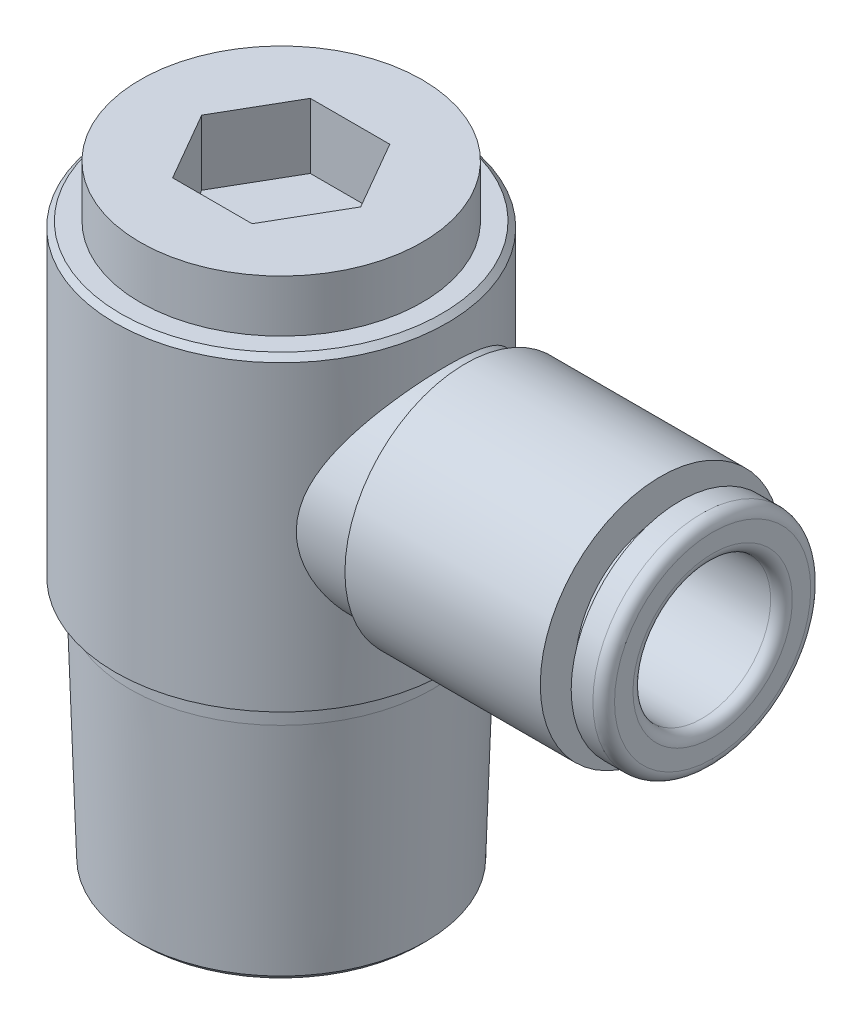
ISO-10303-21;
HEADER;
FILE_DESCRIPTION(('STEP AP214'),'2;1');
FILE_NAME('part.step','',(''),(''),'','','');
FILE_SCHEMA(('AUTOMOTIVE_DESIGN { 1 0 10303 214 1 1 1 1 }'));
ENDSEC;
DATA;
#1=APPLICATION_CONTEXT('core data for automotive mechanical design processes');
#2=APPLICATION_PROTOCOL_DEFINITION('international standard','automotive_design',2000,#1);
#3=PRODUCT_CONTEXT('',#1,'mechanical');
#4=PRODUCT('Part','Part','',(#3));
#5=PRODUCT_RELATED_PRODUCT_CATEGORY('part','',(#4));
#6=PRODUCT_DEFINITION_FORMATION('','',#4);
#7=PRODUCT_DEFINITION_CONTEXT('part definition',#1,'design');
#8=PRODUCT_DEFINITION('design','',#6,#7);
#9=PRODUCT_DEFINITION_SHAPE('','',#8);
#10=(LENGTH_UNIT() NAMED_UNIT(*) SI_UNIT(.MILLI.,.METRE.));
#11=(NAMED_UNIT(*) PLANE_ANGLE_UNIT() SI_UNIT($,.RADIAN.));
#12=(NAMED_UNIT(*) SI_UNIT($,.STERADIAN.) SOLID_ANGLE_UNIT());
#13=UNCERTAINTY_MEASURE_WITH_UNIT(LENGTH_MEASURE(1.E-05),#10,'distance_accuracy_value','');
#14=(GEOMETRIC_REPRESENTATION_CONTEXT(3) GLOBAL_UNCERTAINTY_ASSIGNED_CONTEXT((#13)) GLOBAL_UNIT_ASSIGNED_CONTEXT((#10,
#11,#12)) REPRESENTATION_CONTEXT('',''));
#15=CARTESIAN_POINT('',(0.,0.,0.));
#16=DIRECTION('',(0.,0.,1.));
#17=DIRECTION('',(1.,0.,0.));
#18=AXIS2_PLACEMENT_3D('',#15,#16,#17);
#19=CARTESIAN_POINT('',(0.,28.6374675043084,0.));
#20=DIRECTION('',(0.,-1.,0.));
#21=DIRECTION('',(0.,0.,-1.));
#22=AXIS2_PLACEMENT_3D('',#19,#20,#21);
#23=CYLINDRICAL_SURFACE('',#22,7.65);
#24=CARTESIAN_POINT('',(5.74630315942346,0.,5.05));
#25=CARTESIAN_POINT('',(5.74629139463303,0.123691195261861,5.05000721920626));
#26=CARTESIAN_POINT('',(5.75030910918097,0.247332567179655,5.04545096442382));
#27=CARTESIAN_POINT('',(5.76614951503469,0.493490762692405,5.02734312590222));
#28=CARTESIAN_POINT('',(5.77797375401058,0.616007358412272,5.01378975845184));
#29=CARTESIAN_POINT('',(5.80889561496181,0.858964449909047,4.97792972347576));
#30=CARTESIAN_POINT('',(5.8280023804657,0.979402136004425,4.95561205091152));
#31=CARTESIAN_POINT('',(5.87264713473854,1.21723144511196,4.90262313244986));
#32=CARTESIAN_POINT('',(5.898188387407,1.33462148876934,4.87194764639828));
#33=CARTESIAN_POINT('',(5.98243559048329,1.67888038499296,4.76873133896473));
#34=CARTESIAN_POINT('',(6.04913147660376,1.90042813955573,4.68460339863735));
#35=CARTESIAN_POINT('',(6.19589798944066,2.32576952661268,4.4886868162401));
#36=CARTESIAN_POINT('',(6.27597153993731,2.52955926312297,4.37689212483578));
#37=CARTESIAN_POINT('',(6.45514233643937,2.94784635976894,4.10893354808701));
#38=CARTESIAN_POINT('',(6.55528072361805,3.15925867330915,3.94860759023624));
#39=CARTESIAN_POINT('',(6.70484030309673,3.45573759233572,3.68482201507375));
#40=CARTESIAN_POINT('',(6.75462361573441,3.55118956397302,3.59293088676592));
#41=CARTESIAN_POINT('',(6.8529949039285,3.73491239665336,3.40154680759913));
#42=CARTESIAN_POINT('',(6.90158263782217,3.82318181406821,3.30205233629151));
#43=CARTESIAN_POINT('',(7.00324453769199,4.00397064010181,3.08121000385067));
#44=CARTESIAN_POINT('',(7.05598533373513,4.09533444876548,2.95875885364473));
#45=CARTESIAN_POINT('',(7.1571462005906,4.26726730033949,2.70488767442618));
#46=CARTESIAN_POINT('',(7.20556810595076,4.34784093398731,2.57347149578395));
#47=CARTESIAN_POINT('',(7.29671882217009,4.49728914746075,2.30235395890055));
#48=CARTESIAN_POINT('',(7.33945076731997,4.56617017390557,2.16265722377373));
#49=CARTESIAN_POINT('',(7.41793934480628,4.6912896786022,1.87583718443039));
#50=CARTESIAN_POINT('',(7.45369743366856,4.74753079713867,1.72871543906282));
#51=CARTESIAN_POINT('',(7.51355702226081,4.84093749631828,1.44485979435811));
#52=CARTESIAN_POINT('',(7.53850961177277,4.87952358953594,1.30877238265198));
#53=CARTESIAN_POINT('',(7.58125025191404,4.94529897041313,1.03277874196499));
#54=CARTESIAN_POINT('',(7.59903967022406,4.97249043371587,0.892873247431605));
#55=CARTESIAN_POINT('',(7.62690666268693,5.01497379379546,0.610642080943418));
#56=CARTESIAN_POINT('',(7.63699161067261,5.03027706881593,0.468318856693535));
#57=CARTESIAN_POINT('',(7.64915787014543,5.04872912968681,0.182552906952959));
#58=CARTESIAN_POINT('',(7.65124027555958,5.05187957679778,0.0391103371603215));
#59=CARTESIAN_POINT('',(7.64763364877971,5.04641457782155,-0.225955400612067));
#60=CARTESIAN_POINT('',(7.64306040008323,5.03948847025764,-0.347633129690179));
#61=CARTESIAN_POINT('',(7.62819055642115,5.01690779166283,-0.58986045632534));
#62=CARTESIAN_POINT('',(7.61789228018528,5.00125065658473,-0.710409711903723));
#63=CARTESIAN_POINT('',(7.59180448055886,4.96142345992623,-0.94944704522348));
#64=CARTESIAN_POINT('',(7.57601682246517,4.93725629002777,-1.06793580877952));
#65=CARTESIAN_POINT('',(7.53929739391156,4.8807233317845,-1.30214354928564));
#66=CARTESIAN_POINT('',(7.51836362965036,4.84835436559567,-1.41786143357439));
#67=CARTESIAN_POINT('',(7.44861329574995,4.73972224439264,-1.75905272493581));
#68=CARTESIAN_POINT('',(7.39274058965816,4.65177431497772,-1.97949958816662));
#69=CARTESIAN_POINT('',(7.26634958545281,4.44816660523506,-2.40240357219124));
#70=CARTESIAN_POINT('',(7.19582852449205,4.332501596516,-2.60485728897142));
#71=CARTESIAN_POINT('',(7.03488032391669,4.05995128632964,-3.0145413234963));
#72=CARTESIAN_POINT('',(6.94305653192188,3.89965727126989,-3.21895033027822));
#73=CARTESIAN_POINT('',(6.75345986434751,3.55115218835079,-3.59980606134531));
#74=CARTESIAN_POINT('',(6.65567798898225,3.36289823749249,-3.77620895646911));
#75=CARTESIAN_POINT('',(6.50314355973147,3.04648762707067,-4.0303089961972));
#76=CARTESIAN_POINT('',(6.44771880527447,2.92667678017511,-4.11815279322016));
#77=CARTESIAN_POINT('',(6.33916287706118,2.67906520142981,-4.28337426139859));
#78=CARTESIAN_POINT('',(6.28603220866603,2.55126272414178,-4.36074963440697));
#79=CARTESIAN_POINT('',(6.13292849259747,2.15672796630858,-4.57608477287156));
#80=CARTESIAN_POINT('',(6.0389206642722,1.87823468034047,-4.69776575809332));
#81=CARTESIAN_POINT('',(5.90576339923762,1.37782974938742,-4.86338516205354));
#82=CARTESIAN_POINT('',(5.8586197275703,1.1621115583268,-4.91957065947784));
#83=CARTESIAN_POINT('',(5.80517858746831,0.831844941344904,-4.98228001060879));
#84=CARTESIAN_POINT('',(5.790245714943,0.720673499953082,-4.99958646765062));
#85=CARTESIAN_POINT('',(5.76666561348831,0.496782643347455,-5.0267688298134));
#86=CARTESIAN_POINT('',(5.75801613472114,0.384063796943251,-5.0366473946168));
#87=CARTESIAN_POINT('',(5.74733962350418,0.157426166550954,-5.04882675712101));
#88=CARTESIAN_POINT('',(5.74534062595334,0.0435043286246889,-5.05109547607989));
#89=CARTESIAN_POINT('',(5.74812623634901,-0.184147518210976,-5.04792524343688));
#90=CARTESIAN_POINT('',(5.75291086758124,-0.297877526460553,-5.04248626537729));
#91=CARTESIAN_POINT('',(5.76906733240808,-0.524303501093791,-5.02399367343298));
#92=CARTESIAN_POINT('',(5.78044264327553,-0.636998889698366,-5.010936039885));
#93=CARTESIAN_POINT('',(5.80931661598747,-0.860505600854228,-4.97743120989856));
#94=CARTESIAN_POINT('',(5.82681775630077,-0.971316141751934,-4.95698102237329));
#95=CARTESIAN_POINT('',(5.88579390992046,-1.29027520681462,-4.88708243764574));
#96=CARTESIAN_POINT('',(5.93458101670107,-1.49508787554737,-4.82819240898766));
#97=CARTESIAN_POINT('',(6.04675011727042,-1.89198990206543,-4.68693786953897));
#98=CARTESIAN_POINT('',(6.1101369503137,-2.08407501390485,-4.60456557311215));
#99=CARTESIAN_POINT('',(6.25957633433069,-2.49096480412989,-4.39991729827344));
#100=CARTESIAN_POINT('',(6.34762880049048,-2.70267595523128,-4.27296146028159));
#101=CARTESIAN_POINT('',(6.52874451858613,-3.10430173965737,-3.99075502530789));
#102=CARTESIAN_POINT('',(6.62181376915777,-3.2941893891858,-3.8354700011959));
#103=CARTESIAN_POINT('',(6.76945312542064,-3.57965368485601,-3.56518252798513));
#104=CARTESIAN_POINT('',(6.82471127128938,-3.68285914958474,-3.45849208444374));
#105=CARTESIAN_POINT('',(6.93305481753313,-3.87995300916302,-3.2358243300389));
#106=CARTESIAN_POINT('',(6.98614088810159,-3.97384429083526,-3.11984991689777));
#107=CARTESIAN_POINT('',(7.08876046719279,-4.15160020056074,-2.87907930806883));
#108=CARTESIAN_POINT('',(7.13829574105065,-4.23546982506887,-2.75428755820565));
#109=CARTESIAN_POINT('',(7.23252522560547,-4.39242071986883,-2.49637951868224));
#110=CARTESIAN_POINT('',(7.27722075546268,-4.46550493190175,-2.36326551308694));
#111=CARTESIAN_POINT('',(7.3523965486728,-4.58688758575954,-2.11613968715941));
#112=CARTESIAN_POINT('',(7.38394975704816,-4.63724082096812,-2.00345933207119));
#113=CARTESIAN_POINT('',(7.44248371422754,-4.72988944809466,-1.77369178017961));
#114=CARTESIAN_POINT('',(7.46946531238609,-4.77218633697419,-1.65660540691652));
#115=CARTESIAN_POINT('',(7.51828162729327,-4.84823768302176,-1.41868997406963));
#116=CARTESIAN_POINT('',(7.54011836394911,-4.88199549307404,-1.29786240445549));
#117=CARTESIAN_POINT('',(7.5781595881789,-4.94054634890311,-1.05323771422447));
#118=CARTESIAN_POINT('',(7.59436670525726,-4.96534358024026,-0.929442008939753));
#119=CARTESIAN_POINT('',(7.62083690192441,-5.00573564001993,-0.679153492009262));
#120=CARTESIAN_POINT('',(7.63107324225093,-5.02128907725004,-0.552651138262618));
#121=CARTESIAN_POINT('',(7.64523454165509,-5.04278462620737,-0.298477812825458));
#122=CARTESIAN_POINT('',(7.64915949329999,-5.04872672661561,-0.170806839758873));
#123=CARTESIAN_POINT('',(7.65059793067655,-5.05090580296032,0.084651354803696));
#124=CARTESIAN_POINT('',(7.64811156036865,-5.04714299681169,0.21243857362508));
#125=CARTESIAN_POINT('',(7.63679158334367,-5.02997286600772,0.467072932700768));
#126=CARTESIAN_POINT('',(7.62795822914261,-5.01656592504618,0.593920110151967));
#127=CARTESIAN_POINT('',(7.60497100460109,-4.98154058986129,0.837142631575376));
#128=CARTESIAN_POINT('',(7.59121794425691,-4.9605397516079,0.953645412412757));
#129=CARTESIAN_POINT('',(7.55868173472171,-4.91060305350584,1.18423665510924));
#130=CARTESIAN_POINT('',(7.53989687878237,-4.88166450116244,1.29832428357183));
#131=CARTESIAN_POINT('',(7.47654311178555,-4.78343465310628,1.63586456751513));
#132=CARTESIAN_POINT('',(7.4249552279865,-4.70269976745669,1.85479417024908));
#133=CARTESIAN_POINT('',(7.30316269376434,-4.50802649664417,2.28920696971806));
#134=CARTESIAN_POINT('',(7.23199401661586,-4.39232447570483,2.50361451374155));
#135=CARTESIAN_POINT('',(7.07794345404609,-4.13377137239365,2.91078200304152));
#136=CARTESIAN_POINT('',(6.99505401956184,-3.99090277206262,3.10352785179693));
#137=CARTESIAN_POINT('',(6.80953227266373,-3.65677888017987,3.49377274135197));
#138=CARTESIAN_POINT('',(6.70584194601086,-3.46144931254873,3.68728059793821));
#139=CARTESIAN_POINT('',(6.49913391873765,-3.04173357205072,4.04050125834097));
#140=CARTESIAN_POINT('',(6.39611669857776,-2.8173286147397,4.2001920370474));
#141=CARTESIAN_POINT('',(6.21057419850602,-2.36428045178193,4.46938720627344));
#142=CARTESIAN_POINT('',(6.1270326534001,-2.13803046150941,4.5822032748568));
#143=CARTESIAN_POINT('',(5.97877850171568,-1.66600231461028,4.77404254677683));
#144=CARTESIAN_POINT('',(5.91402588265974,-1.42026709662771,4.85313773257518));
#145=CARTESIAN_POINT('',(5.82606130649867,-0.978396860963152,4.95811840716984));
#146=CARTESIAN_POINT('',(5.79647474663358,-0.785524689634158,4.9924175419868));
#147=CARTESIAN_POINT('',(5.75661031012049,-0.395057601703623,5.03834641658278));
#148=CARTESIAN_POINT('',(5.74632194118064,-0.197465310617384,5.0499884749856));
#149=CARTESIAN_POINT('',(5.74630315942346,0.,5.05));
#150=B_SPLINE_CURVE_WITH_KNOTS('',3,(#24,#25,#26,#27,#28,#29,#30,#31,#32,#33,#34,#35,#36,#37,
#38,#39,#40,#41,#42,#43,#44,#45,#46,#47,#48,#49,#50,#51,#52,#53,#54,#55,#56,#57,#58,#59,#60,#61,
#62,#63,#64,#65,#66,#67,#68,#69,#70,#71,#72,#73,#74,#75,#76,#77,#78,#79,#80,#81,#82,#83,#84,#85,
#86,#87,#88,#89,#90,#91,#92,#93,#94,#95,#96,#97,#98,#99,#100,#101,#102,#103,#104,#105,#106,#107,
#108,#109,#110,#111,#112,#113,#114,#115,#116,#117,#118,#119,#120,#121,#122,#123,#124,#125,#126,
#127,#128,#129,#130,#131,#132,#133,#134,#135,#136,#137,#138,#139,#140,#141,#142,#143,#144,#145,
#146,#147,#148,#149),.UNSPECIFIED.,.T.,.F.,(4,2,2,2,2,2,2,2,2,2,2,2,2,2,2,2,2,2,2,2,2,2,2,2,2,2,
2,2,2,2,2,2,2,2,2,2,2,2,2,2,2,2,2,2,2,2,2,2,2,2,2,2,2,2,2,2,2,2,2,2,2,2,4),(0.,
0.370840925247365,0.741755393060012,1.11313710240258,1.48470757610909,2.22001288495959,
2.95547911056464,3.80279714031537,4.22711073554562,4.65150940437718,5.13574755413301,
5.61977902317842,6.10354275267311,6.58720533716253,7.01746801647349,7.44764850574588,
7.87741675813843,8.30712626022486,8.67256438552988,9.03810988587533,9.40353129472779,
9.7690945057734,10.497388587291,11.2258201583329,12.0492638411166,12.8739837617115,
13.34915900205,13.8244383895614,14.7724003121907,15.4530126678554,15.7931269158341,
16.1331193220843,16.4745431520066,16.8159681539146,17.1575734574723,17.4993171322701,
18.1525420651435,18.8059838296506,19.5895572416453,20.3740893148105,20.8487761976557,
21.3233154941219,21.7976172055785,22.2717893103182,22.6535740424737,23.0352877652928,
23.4168513740761,23.7982365202459,24.1813167852599,24.564397501416,24.9474696159158,
25.3305264906589,25.6876430539065,26.0448809022075,26.7587556262314,27.5173645825587,
28.2764643855832,29.1545581704399,30.0332221119402,30.8290652330075,31.6232008922298,
32.2155475441831,32.8075720479368),.UNSPECIFIED.);
#151=CARTESIAN_POINT('',(5.74630315942346,0.,5.05));
#152=VERTEX_POINT('',#151);
#153=EDGE_CURVE('E128',#152,#152,#150,.T.);
#154=ORIENTED_EDGE('',*,*,#153,.T.);
#155=EDGE_LOOP('',(#154));
#156=FACE_BOUND('',#155,.T.);
#157=CARTESIAN_POINT('',(0.,6.75,0.));
#158=DIRECTION('',(0.,1.,0.));
#159=DIRECTION('',(0.,0.,1.));
#160=AXIS2_PLACEMENT_3D('',#157,#158,#159);
#161=CIRCLE('',#160,7.65);
#162=CARTESIAN_POINT('',(0.,6.75,7.65));
#163=VERTEX_POINT('',#162);
#164=EDGE_CURVE('E204',#163,#163,#161,.F.);
#165=ORIENTED_EDGE('',*,*,#164,.T.);
#166=EDGE_LOOP('',(#165));
#167=FACE_BOUND('',#166,.T.);
#168=CARTESIAN_POINT('',(0.,-7.2,0.));
#169=DIRECTION('',(0.,1.,0.));
#170=DIRECTION('',(0.,0.,1.));
#171=AXIS2_PLACEMENT_3D('',#168,#169,#170);
#172=CIRCLE('',#171,7.65);
#173=CARTESIAN_POINT('',(0.,-7.2,7.65));
#174=VERTEX_POINT('',#173);
#175=EDGE_CURVE('E278',#174,#174,#172,.F.);
#176=ORIENTED_EDGE('',*,*,#175,.F.);
#177=EDGE_LOOP('',(#176));
#178=FACE_BOUND('',#177,.T.);
#179=ADVANCED_FACE('F37',(#156,#167,#178),#23,.T.);
#180=CARTESIAN_POINT('',(0.,7.,0.));
#181=DIRECTION('',(0.,1.,0.));
#182=DIRECTION('',(0.,0.,1.));
#183=AXIS2_PLACEMENT_3D('',#180,#181,#182);
#184=PLANE('',#183);
#185=CARTESIAN_POINT('',(0.,7.,0.));
#186=DIRECTION('',(0.,1.,0.));
#187=DIRECTION('',(0.,0.,1.));
#188=AXIS2_PLACEMENT_3D('',#185,#186,#187);
#189=CIRCLE('',#188,6.5);
#190=CARTESIAN_POINT('',(0.,7.,-6.5));
#191=VERTEX_POINT('',#190);
#192=EDGE_CURVE('E141',#191,#191,#189,.T.);
#193=ORIENTED_EDGE('',*,*,#192,.F.);
#194=EDGE_LOOP('',(#193));
#195=FACE_BOUND('',#194,.T.);
#196=CARTESIAN_POINT('',(0.,7.,0.));
#197=DIRECTION('',(0.,1.,0.));
#198=DIRECTION('',(0.,0.,1.));
#199=AXIS2_PLACEMENT_3D('',#196,#197,#198);
#200=CIRCLE('',#199,7.4);
#201=CARTESIAN_POINT('',(0.,7.,7.4));
#202=VERTEX_POINT('',#201);
#203=EDGE_CURVE('E280',#202,#202,#200,.T.);
#204=ORIENTED_EDGE('',*,*,#203,.T.);
#205=EDGE_LOOP('',(#204));
#206=FACE_BOUND('',#205,.T.);
#207=ADVANCED_FACE('F265',(#195,#206),#184,.T.);
#208=CARTESIAN_POINT('',(0.,-7.2,0.));
#209=DIRECTION('',(0.,1.,0.));
#210=DIRECTION('',(0.,0.,1.));
#211=AXIS2_PLACEMENT_3D('',#208,#209,#210);
#212=PLANE('',#211);
#213=CARTESIAN_POINT('',(0.,-7.2,0.));
#214=DIRECTION('',(0.,1.,0.));
#215=DIRECTION('',(0.,0.,1.));
#216=AXIS2_PLACEMENT_3D('',#213,#214,#215);
#217=CIRCLE('',#216,7.);
#218=CARTESIAN_POINT('',(0.,-7.2,7.));
#219=VERTEX_POINT('',#218);
#220=EDGE_CURVE('E152',#219,#219,#217,.T.);
#221=ORIENTED_EDGE('',*,*,#220,.T.);
#222=EDGE_LOOP('',(#221));
#223=FACE_BOUND('',#222,.T.);
#224=ORIENTED_EDGE('',*,*,#175,.T.);
#225=EDGE_LOOP('',(#224));
#226=FACE_BOUND('',#225,.T.);
#227=ADVANCED_FACE('F187',(#223,#226),#212,.F.);
#228=CARTESIAN_POINT('',(0.,7.,0.));
#229=DIRECTION('',(0.,-1.,0.));
#230=DIRECTION('',(0.,0.,-1.));
#231=AXIS2_PLACEMENT_3D('',#228,#229,#230);
#232=CONICAL_SURFACE('',#231,7.4,0.785398163397445);
#233=ORIENTED_EDGE('',*,*,#164,.F.);
#234=EDGE_LOOP('',(#233));
#235=FACE_BOUND('',#234,.T.);
#236=ORIENTED_EDGE('',*,*,#203,.F.);
#237=EDGE_LOOP('',(#236));
#238=FACE_BOUND('',#237,.T.);
#239=ADVANCED_FACE('F185',(#235,#238),#232,.T.);
#240=CARTESIAN_POINT('',(0.,-27.9989898732233,0.));
#241=DIRECTION('',(0.,1.,0.));
#242=DIRECTION('',(0.,0.,1.));
#243=AXIS2_PLACEMENT_3D('',#240,#241,#242);
#244=CYLINDRICAL_SURFACE('',#243,7.);
#245=CARTESIAN_POINT('',(0.,-8.2,0.));
#246=DIRECTION('',(0.,-1.,0.));
#247=DIRECTION('',(0.,0.,1.));
#248=AXIS2_PLACEMENT_3D('',#245,#246,#247);
#249=CIRCLE('',#248,6.98953509812547);
#250=CARTESIAN_POINT('',(0.,-8.2,6.98953509812547));
#251=VERTEX_POINT('',#250);
#252=EDGE_CURVE('E157',#251,#251,#249,.T.);
#253=ORIENTED_EDGE('',*,*,#252,.F.);
#254=EDGE_LOOP('',(#253));
#255=FACE_BOUND('',#254,.T.);
#256=ORIENTED_EDGE('',*,*,#220,.F.);
#257=EDGE_LOOP('',(#256));
#258=FACE_BOUND('',#257,.T.);
#259=ADVANCED_FACE('F180',(#255,#258),#244,.T.);
#260=CARTESIAN_POINT('',(-6.66322807578305,-18.7,0.));
#261=DIRECTION('',(0.,-1.,0.));
#262=DIRECTION('',(0.,0.,-1.));
#263=AXIS2_PLACEMENT_3D('',#260,#261,#262);
#264=PLANE('',#263);
#265=CARTESIAN_POINT('',(0.,-18.7,0.));
#266=DIRECTION('',(0.,1.,0.));
#267=DIRECTION('',(0.,0.,-1.));
#268=AXIS2_PLACEMENT_3D('',#265,#266,#267);
#269=CIRCLE('',#268,1.5875);
#270=CARTESIAN_POINT('',(0.,-18.7,-1.5875));
#271=VERTEX_POINT('',#270);
#272=EDGE_CURVE('E520',#271,#271,#269,.T.);
#273=ORIENTED_EDGE('',*,*,#272,.T.);
#274=EDGE_LOOP('',(#273));
#275=FACE_BOUND('',#274,.T.);
#276=CARTESIAN_POINT('',(0.,-18.7,0.));
#277=DIRECTION('',(0.,-1.,0.));
#278=DIRECTION('',(0.,0.,-1.));
#279=AXIS2_PLACEMENT_3D('',#276,#277,#278);
#280=CIRCLE('',#279,6.41322807578305);
#281=CARTESIAN_POINT('',(0.,-18.7,-6.41322807578305));
#282=VERTEX_POINT('',#281);
#283=EDGE_CURVE('E203',#282,#282,#280,.T.);
#284=ORIENTED_EDGE('',*,*,#283,.T.);
#285=EDGE_LOOP('',(#284));
#286=FACE_BOUND('',#285,.T.);
#287=ADVANCED_FACE('F174',(#275,#286),#264,.T.);
#288=CARTESIAN_POINT('',(0.,-8.2,0.));
#289=DIRECTION('',(0.,1.,0.));
#290=DIRECTION('',(0.,0.,1.));
#291=AXIS2_PLACEMENT_3D('',#288,#289,#290);
#292=CONICAL_SURFACE('',#291,6.98953509812547,0.0310668606855029);
#293=CARTESIAN_POINT('',(0.,-18.4419815984457,0.));
#294=DIRECTION('',(0.,-1.,0.));
#295=DIRECTION('',(0.,0.,-1.));
#296=AXIS2_PLACEMENT_3D('',#293,#294,#295);
#297=CIRCLE('',#296,6.67124647733741);
#298=CARTESIAN_POINT('',(0.,-18.4419815984457,-6.67124647733741));
#299=VERTEX_POINT('',#298);
#300=EDGE_CURVE('E195',#299,#299,#297,.F.);
#301=ORIENTED_EDGE('',*,*,#300,.T.);
#302=EDGE_LOOP('',(#301));
#303=FACE_BOUND('',#302,.T.);
#304=ORIENTED_EDGE('',*,*,#252,.T.);
#305=EDGE_LOOP('',(#304));
#306=FACE_BOUND('',#305,.T.);
#307=ADVANCED_FACE('F163',(#303,#306),#292,.T.);
#308=CARTESIAN_POINT('',(0.,-18.4419815984456,0.));
#309=DIRECTION('',(0.,1.,0.));
#310=DIRECTION('',(0.,0.,1.));
#311=AXIS2_PLACEMENT_3D('',#308,#309,#310);
#312=CONICAL_SURFACE('',#311,6.67124647733741,0.785398163397448);
#313=ORIENTED_EDGE('',*,*,#283,.F.);
#314=EDGE_LOOP('',(#313));
#315=FACE_BOUND('',#314,.T.);
#316=ORIENTED_EDGE('',*,*,#300,.F.);
#317=EDGE_LOOP('',(#316));
#318=FACE_BOUND('',#317,.T.);
#319=ADVANCED_FACE('F173',(#315,#318),#312,.T.);
#320=CARTESIAN_POINT('',(0.,27.7847763108502,0.));
#321=DIRECTION('',(0.,-1.,0.));
#322=DIRECTION('',(0.,0.,-1.));
#323=AXIS2_PLACEMENT_3D('',#320,#321,#322);
#324=CYLINDRICAL_SURFACE('',#323,6.5);
#325=CARTESIAN_POINT('',(0.,9.4,0.));
#326=DIRECTION('',(0.,1.,0.));
#327=DIRECTION('',(0.,0.,1.));
#328=AXIS2_PLACEMENT_3D('',#325,#326,#327);
#329=CIRCLE('',#328,6.5);
#330=CARTESIAN_POINT('',(0.,9.4,-6.5));
#331=VERTEX_POINT('',#330);
#332=EDGE_CURVE('E149',#331,#331,#329,.T.);
#333=CARTESIAN_POINT('',(0.,7.,-6.5));
#334=CARTESIAN_POINT('',(0.,7.025,-6.5));
#335=CARTESIAN_POINT('',(0.,7.05,-6.5));
#336=CARTESIAN_POINT('',(0.,7.1,-6.5));
#337=CARTESIAN_POINT('',(0.,7.125,-6.5));
#338=CARTESIAN_POINT('',(0.,7.175,-6.5));
#339=CARTESIAN_POINT('',(0.,7.2,-6.5));
#340=CARTESIAN_POINT('',(0.,7.25,-6.5));
#341=CARTESIAN_POINT('',(0.,7.275,-6.5));
#342=CARTESIAN_POINT('',(0.,7.325,-6.5));
#343=CARTESIAN_POINT('',(0.,7.35,-6.5));
#344=CARTESIAN_POINT('',(0.,7.4,-6.5));
#345=CARTESIAN_POINT('',(0.,7.425,-6.5));
#346=CARTESIAN_POINT('',(0.,7.475,-6.5));
#347=CARTESIAN_POINT('',(0.,7.5,-6.5));
#348=CARTESIAN_POINT('',(0.,7.55,-6.5));
#349=CARTESIAN_POINT('',(0.,7.575,-6.5));
#350=CARTESIAN_POINT('',(0.,7.625,-6.5));
#351=CARTESIAN_POINT('',(0.,7.65,-6.5));
#352=CARTESIAN_POINT('',(0.,7.7,-6.5));
#353=CARTESIAN_POINT('',(0.,7.725,-6.5));
#354=CARTESIAN_POINT('',(0.,7.775,-6.5));
#355=CARTESIAN_POINT('',(0.,7.8,-6.5));
#356=CARTESIAN_POINT('',(0.,7.85,-6.5));
#357=CARTESIAN_POINT('',(0.,7.875,-6.5));
#358=CARTESIAN_POINT('',(0.,7.925,-6.5));
#359=CARTESIAN_POINT('',(0.,7.95,-6.5));
#360=CARTESIAN_POINT('',(0.,8.,-6.5));
#361=CARTESIAN_POINT('',(0.,8.025,-6.5));
#362=CARTESIAN_POINT('',(0.,8.075,-6.5));
#363=CARTESIAN_POINT('',(0.,8.1,-6.5));
#364=CARTESIAN_POINT('',(0.,8.15,-6.5));
#365=CARTESIAN_POINT('',(0.,8.175,-6.5));
#366=CARTESIAN_POINT('',(0.,8.225,-6.5));
#367=CARTESIAN_POINT('',(0.,8.25,-6.5));
#368=CARTESIAN_POINT('',(0.,8.3,-6.5));
#369=CARTESIAN_POINT('',(0.,8.325,-6.5));
#370=CARTESIAN_POINT('',(0.,8.375,-6.5));
#371=CARTESIAN_POINT('',(0.,8.4,-6.5));
#372=CARTESIAN_POINT('',(0.,8.45,-6.5));
#373=CARTESIAN_POINT('',(0.,8.475,-6.5));
#374=CARTESIAN_POINT('',(0.,8.525,-6.5));
#375=CARTESIAN_POINT('',(0.,8.55,-6.5));
#376=CARTESIAN_POINT('',(0.,8.6,-6.5));
#377=CARTESIAN_POINT('',(0.,8.625,-6.5));
#378=CARTESIAN_POINT('',(0.,8.675,-6.5));
#379=CARTESIAN_POINT('',(0.,8.7,-6.5));
#380=CARTESIAN_POINT('',(0.,8.75,-6.5));
#381=CARTESIAN_POINT('',(0.,8.775,-6.5));
#382=CARTESIAN_POINT('',(0.,8.825,-6.5));
#383=CARTESIAN_POINT('',(0.,8.85,-6.5));
#384=CARTESIAN_POINT('',(0.,8.9,-6.5));
#385=CARTESIAN_POINT('',(0.,8.925,-6.5));
#386=CARTESIAN_POINT('',(0.,8.975,-6.5));
#387=CARTESIAN_POINT('',(0.,9.,-6.5));
#388=CARTESIAN_POINT('',(0.,9.05,-6.5));
#389=CARTESIAN_POINT('',(0.,9.075,-6.5));
#390=CARTESIAN_POINT('',(0.,9.125,-6.5));
#391=CARTESIAN_POINT('',(0.,9.15,-6.5));
#392=CARTESIAN_POINT('',(0.,9.2,-6.5));
#393=CARTESIAN_POINT('',(0.,9.225,-6.5));
#394=CARTESIAN_POINT('',(0.,9.275,-6.5));
#395=CARTESIAN_POINT('',(0.,9.3,-6.5));
#396=CARTESIAN_POINT('',(0.,9.35,-6.5));
#397=CARTESIAN_POINT('',(0.,9.375,-6.5));
#398=CARTESIAN_POINT('',(0.,9.4,-6.5));
#399=B_SPLINE_CURVE_WITH_KNOTS('',3,(#333,#334,#335,#336,#337,#338,#339,#340,#341,#342,#343,
#344,#345,#346,#347,#348,#349,#350,#351,#352,#353,#354,#355,#356,#357,#358,#359,#360,#361,#362,
#363,#364,#365,#366,#367,#368,#369,#370,#371,#372,#373,#374,#375,#376,#377,#378,#379,#380,#381,
#382,#383,#384,#385,#386,#387,#388,#389,#390,#391,#392,#393,#394,#395,#396,#397,#398),
.UNSPECIFIED.,.F.,.F.,(4,2,2,2,2,2,2,2,2,2,2,2,2,2,2,2,2,2,2,2,2,2,2,2,2,2,2,2,2,2,2,2,4),(0.,
0.0749999999999987,0.150000000000001,0.225,0.300000000000002,0.375,0.449999999999999,
0.525000000000001,0.6,0.674999999999998,0.750000000000001,0.824999999999999,0.899999999999998,
0.975,1.05,1.125,1.2,1.275,1.35,1.425,1.5,1.575,1.65,1.725,1.8,1.875,1.95,2.025,2.1,2.175,2.25,
2.325,2.4),.UNSPECIFIED.);
#400=EDGE_CURVE('BSEAM254',#191,#331,#399,.T.);
#401=ORIENTED_EDGE('',*,*,#192,.T.);
#402=ORIENTED_EDGE('',*,*,#332,.F.);
#403=ORIENTED_EDGE('',*,*,#400,.T.);
#404=ORIENTED_EDGE('',*,*,#400,.F.);
#405=EDGE_LOOP('',(#401,#403,#402,#404));
#406=FACE_BOUND('',#405,.T.);
#407=ADVANCED_FACE('F254',(#406),#324,.T.);
#408=CARTESIAN_POINT('',(0.,9.4,0.));
#409=DIRECTION('',(0.,1.,0.));
#410=DIRECTION('',(0.,0.,1.));
#411=AXIS2_PLACEMENT_3D('',#408,#409,#410);
#412=PLANE('',#411);
#413=DIRECTION('',(1.,0.,0.));
#414=VECTOR('',#413,1.);
#415=CARTESIAN_POINT('',(-1.83308710467706,9.4,3.175));
#416=LINE('',#415,#414);
#417=CARTESIAN_POINT('',(-1.83308710467706,9.4,3.175));
#418=VERTEX_POINT('',#417);
#419=CARTESIAN_POINT('',(1.83308710467706,9.4,3.175));
#420=VERTEX_POINT('',#419);
#421=EDGE_CURVE('E53',#418,#420,#416,.T.);
#422=ORIENTED_EDGE('',*,*,#421,.F.);
#423=DIRECTION('',(0.5,0.,0.866025403784439));
#424=VECTOR('',#423,1.);
#425=CARTESIAN_POINT('',(-3.66617420935412,9.4,0.));
#426=LINE('',#425,#424);
#427=CARTESIAN_POINT('',(-3.66617420935412,9.4,0.));
#428=VERTEX_POINT('',#427);
#429=EDGE_CURVE('E137',#428,#418,#426,.T.);
#430=ORIENTED_EDGE('',*,*,#429,.F.);
#431=DIRECTION('',(-0.5,0.,0.866025403784438));
#432=VECTOR('',#431,1.);
#433=CARTESIAN_POINT('',(-1.83308710467706,9.4,-3.175));
#434=LINE('',#433,#432);
#435=CARTESIAN_POINT('',(-1.83308710467706,9.4,-3.175));
#436=VERTEX_POINT('',#435);
#437=EDGE_CURVE('E135',#436,#428,#434,.T.);
#438=ORIENTED_EDGE('',*,*,#437,.F.);
#439=DIRECTION('',(-1.,0.,0.));
#440=VECTOR('',#439,1.);
#441=CARTESIAN_POINT('',(1.83308710467706,9.4,-3.175));
#442=LINE('',#441,#440);
#443=CARTESIAN_POINT('',(1.83308710467706,9.4,-3.175));
#444=VERTEX_POINT('',#443);
#445=EDGE_CURVE('E101',#444,#436,#442,.T.);
#446=ORIENTED_EDGE('',*,*,#445,.F.);
#447=DIRECTION('',(-0.5,0.,-0.866025403784439));
#448=VECTOR('',#447,1.);
#449=CARTESIAN_POINT('',(3.66617420935412,9.4,0.));
#450=LINE('',#449,#448);
#451=CARTESIAN_POINT('',(3.66617420935412,9.4,0.));
#452=VERTEX_POINT('',#451);
#453=EDGE_CURVE('E131',#452,#444,#450,.T.);
#454=ORIENTED_EDGE('',*,*,#453,.F.);
#455=DIRECTION('',(0.5,0.,-0.866025403784439));
#456=VECTOR('',#455,1.);
#457=CARTESIAN_POINT('',(1.83308710467706,9.4,3.175));
#458=LINE('',#457,#456);
#459=EDGE_CURVE('E127',#420,#452,#458,.T.);
#460=ORIENTED_EDGE('',*,*,#459,.F.);
#461=EDGE_LOOP('',(#422,#430,#438,#446,#454,#460));
#462=FACE_BOUND('',#461,.T.);
#463=ORIENTED_EDGE('',*,*,#332,.T.);
#464=EDGE_LOOP('',(#463));
#465=FACE_BOUND('',#464,.T.);
#466=ADVANCED_FACE('F176',(#462,#465),#412,.T.);
#467=CARTESIAN_POINT('',(-1.83308710467706,6.4,3.175));
#468=DIRECTION('',(0.,0.,1.));
#469=DIRECTION('',(1.,0.,0.));
#470=AXIS2_PLACEMENT_3D('',#467,#468,#469);
#471=PLANE('',#470);
#472=ORIENTED_EDGE('',*,*,#421,.T.);
#473=DIRECTION('',(0.,1.,0.));
#474=VECTOR('',#473,1.);
#475=CARTESIAN_POINT('',(1.83308710467706,6.4,3.175));
#476=LINE('',#475,#474);
#477=CARTESIAN_POINT('',(1.83308710467706,6.4,3.175));
#478=VERTEX_POINT('',#477);
#479=EDGE_CURVE('E83',#478,#420,#476,.T.);
#480=ORIENTED_EDGE('',*,*,#479,.F.);
#481=DIRECTION('',(1.,0.,0.));
#482=VECTOR('',#481,1.);
#483=CARTESIAN_POINT('',(-1.83308710467706,6.4,3.175));
#484=LINE('',#483,#482);
#485=CARTESIAN_POINT('',(-1.83308710467706,6.4,3.175));
#486=VERTEX_POINT('',#485);
#487=EDGE_CURVE('E139',#486,#478,#484,.T.);
#488=ORIENTED_EDGE('',*,*,#487,.F.);
#489=DIRECTION('',(0.,1.,0.));
#490=VECTOR('',#489,1.);
#491=CARTESIAN_POINT('',(-1.83308710467706,6.4,3.175));
#492=LINE('',#491,#490);
#493=EDGE_CURVE('E61',#486,#418,#492,.T.);
#494=ORIENTED_EDGE('',*,*,#493,.T.);
#495=EDGE_LOOP('',(#472,#480,#488,#494));
#496=FACE_BOUND('',#495,.T.);
#497=ADVANCED_FACE('F241',(#496),#471,.F.);
#498=CARTESIAN_POINT('',(-3.66617420935412,6.4,0.));
#499=DIRECTION('',(-0.866025403784439,0.,0.5));
#500=DIRECTION('',(0.5,0.,0.866025403784439));
#501=AXIS2_PLACEMENT_3D('',#498,#499,#500);
#502=PLANE('',#501);
#503=ORIENTED_EDGE('',*,*,#429,.T.);
#504=ORIENTED_EDGE('',*,*,#493,.F.);
#505=DIRECTION('',(0.5,0.,0.866025403784439));
#506=VECTOR('',#505,1.);
#507=CARTESIAN_POINT('',(-3.66617420935412,6.4,0.));
#508=LINE('',#507,#506);
#509=CARTESIAN_POINT('',(-3.66617420935412,6.4,0.));
#510=VERTEX_POINT('',#509);
#511=EDGE_CURVE('E113',#510,#486,#508,.T.);
#512=ORIENTED_EDGE('',*,*,#511,.F.);
#513=DIRECTION('',(0.,1.,0.));
#514=VECTOR('',#513,1.);
#515=CARTESIAN_POINT('',(-3.66617420935412,6.4,0.));
#516=LINE('',#515,#514);
#517=EDGE_CURVE('E105',#510,#428,#516,.T.);
#518=ORIENTED_EDGE('',*,*,#517,.T.);
#519=EDGE_LOOP('',(#503,#504,#512,#518));
#520=FACE_BOUND('',#519,.T.);
#521=ADVANCED_FACE('F238',(#520),#502,.F.);
#522=CARTESIAN_POINT('',(-1.83308710467706,6.4,-3.175));
#523=DIRECTION('',(-0.866025403784439,0.,-0.5));
#524=DIRECTION('',(-0.5,0.,0.866025403784439));
#525=AXIS2_PLACEMENT_3D('',#522,#523,#524);
#526=PLANE('',#525);
#527=ORIENTED_EDGE('',*,*,#437,.T.);
#528=ORIENTED_EDGE('',*,*,#517,.F.);
#529=DIRECTION('',(-0.5,0.,0.866025403784438));
#530=VECTOR('',#529,1.);
#531=CARTESIAN_POINT('',(-1.83308710467706,6.4,-3.175));
#532=LINE('',#531,#530);
#533=CARTESIAN_POINT('',(-1.83308710467706,6.4,-3.175));
#534=VERTEX_POINT('',#533);
#535=EDGE_CURVE('E109',#534,#510,#532,.T.);
#536=ORIENTED_EDGE('',*,*,#535,.F.);
#537=DIRECTION('',(0.,1.,0.));
#538=VECTOR('',#537,1.);
#539=CARTESIAN_POINT('',(-1.83308710467706,6.4,-3.175));
#540=LINE('',#539,#538);
#541=EDGE_CURVE('E94',#534,#436,#540,.T.);
#542=ORIENTED_EDGE('',*,*,#541,.T.);
#543=EDGE_LOOP('',(#527,#528,#536,#542));
#544=FACE_BOUND('',#543,.T.);
#545=ADVANCED_FACE('F110',(#544),#526,.F.);
#546=CARTESIAN_POINT('',(1.83308710467706,6.4,-3.175));
#547=DIRECTION('',(0.,0.,-1.));
#548=DIRECTION('',(-1.,0.,0.));
#549=AXIS2_PLACEMENT_3D('',#546,#547,#548);
#550=PLANE('',#549);
#551=ORIENTED_EDGE('',*,*,#445,.T.);
#552=ORIENTED_EDGE('',*,*,#541,.F.);
#553=DIRECTION('',(-1.,0.,0.));
#554=VECTOR('',#553,1.);
#555=CARTESIAN_POINT('',(1.83308710467706,6.4,-3.175));
#556=LINE('',#555,#554);
#557=CARTESIAN_POINT('',(1.83308710467706,6.4,-3.175));
#558=VERTEX_POINT('',#557);
#559=EDGE_CURVE('E98',#558,#534,#556,.T.);
#560=ORIENTED_EDGE('',*,*,#559,.F.);
#561=DIRECTION('',(0.,1.,0.));
#562=VECTOR('',#561,1.);
#563=CARTESIAN_POINT('',(1.83308710467706,6.4,-3.175));
#564=LINE('',#563,#562);
#565=EDGE_CURVE('E106',#558,#444,#564,.T.);
#566=ORIENTED_EDGE('',*,*,#565,.T.);
#567=EDGE_LOOP('',(#551,#552,#560,#566));
#568=FACE_BOUND('',#567,.T.);
#569=ADVANCED_FACE('F96',(#568),#550,.F.);
#570=CARTESIAN_POINT('',(3.66617420935412,6.4,0.));
#571=DIRECTION('',(0.866025403784439,0.,-0.5));
#572=DIRECTION('',(-0.5,0.,-0.866025403784439));
#573=AXIS2_PLACEMENT_3D('',#570,#571,#572);
#574=PLANE('',#573);
#575=ORIENTED_EDGE('',*,*,#453,.T.);
#576=ORIENTED_EDGE('',*,*,#565,.F.);
#577=DIRECTION('',(-0.5,0.,-0.866025403784439));
#578=VECTOR('',#577,1.);
#579=CARTESIAN_POINT('',(3.66617420935412,6.4,0.));
#580=LINE('',#579,#578);
#581=CARTESIAN_POINT('',(3.66617420935412,6.4,0.));
#582=VERTEX_POINT('',#581);
#583=EDGE_CURVE('E119',#582,#558,#580,.T.);
#584=ORIENTED_EDGE('',*,*,#583,.F.);
#585=DIRECTION('',(0.,1.,0.));
#586=VECTOR('',#585,1.);
#587=CARTESIAN_POINT('',(3.66617420935412,6.4,0.));
#588=LINE('',#587,#586);
#589=EDGE_CURVE('E144',#582,#452,#588,.T.);
#590=ORIENTED_EDGE('',*,*,#589,.T.);
#591=EDGE_LOOP('',(#575,#576,#584,#590));
#592=FACE_BOUND('',#591,.T.);
#593=ADVANCED_FACE('F246',(#592),#574,.F.);
#594=CARTESIAN_POINT('',(1.83308710467706,6.4,3.175));
#595=DIRECTION('',(0.866025403784439,0.,0.5));
#596=DIRECTION('',(0.5,0.,-0.866025403784439));
#597=AXIS2_PLACEMENT_3D('',#594,#595,#596);
#598=PLANE('',#597);
#599=ORIENTED_EDGE('',*,*,#459,.T.);
#600=ORIENTED_EDGE('',*,*,#589,.F.);
#601=DIRECTION('',(0.5,0.,-0.866025403784439));
#602=VECTOR('',#601,1.);
#603=CARTESIAN_POINT('',(1.83308710467706,6.4,3.175));
#604=LINE('',#603,#602);
#605=EDGE_CURVE('E121',#478,#582,#604,.T.);
#606=ORIENTED_EDGE('',*,*,#605,.F.);
#607=ORIENTED_EDGE('',*,*,#479,.T.);
#608=EDGE_LOOP('',(#599,#600,#606,#607));
#609=FACE_BOUND('',#608,.T.);
#610=ADVANCED_FACE('F237',(#609),#598,.F.);
#611=CARTESIAN_POINT('',(5.49926131403118,6.4,3.175));
#612=DIRECTION('',(0.,1.,0.));
#613=DIRECTION('',(0.,0.,1.));
#614=AXIS2_PLACEMENT_3D('',#611,#612,#613);
#615=PLANE('',#614);
#616=ORIENTED_EDGE('',*,*,#487,.T.);
#617=ORIENTED_EDGE('',*,*,#605,.T.);
#618=ORIENTED_EDGE('',*,*,#583,.T.);
#619=ORIENTED_EDGE('',*,*,#559,.T.);
#620=ORIENTED_EDGE('',*,*,#535,.T.);
#621=ORIENTED_EDGE('',*,*,#511,.T.);
#622=EDGE_LOOP('',(#616,#617,#618,#619,#620,#621));
#623=FACE_BOUND('',#622,.T.);
#624=ADVANCED_FACE('F116',(#623),#615,.T.);
#625=CARTESIAN_POINT('',(-16.3355334196476,0.,0.));
#626=DIRECTION('',(-1.,0.,0.));
#627=DIRECTION('',(0.,0.,1.));
#628=AXIS2_PLACEMENT_3D('',#625,#626,#627);
#629=CYLINDRICAL_SURFACE('',#628,5.05);
#630=CARTESIAN_POINT('',(8.2,0.,0.));
#631=DIRECTION('',(-1.,0.,0.));
#632=DIRECTION('',(0.,0.,1.));
#633=AXIS2_PLACEMENT_3D('',#630,#631,#632);
#634=CIRCLE('',#633,5.05);
#635=CARTESIAN_POINT('',(8.2,0.,5.05));
#636=VERTEX_POINT('',#635);
#637=EDGE_CURVE('E535',#636,#636,#634,.T.);
#638=ORIENTED_EDGE('',*,*,#637,.T.);
#639=EDGE_LOOP('',(#638));
#640=FACE_BOUND('',#639,.T.);
#641=ORIENTED_EDGE('',*,*,#153,.F.);
#642=EDGE_LOOP('',(#641));
#643=FACE_BOUND('',#642,.T.);
#644=ADVANCED_FACE('F215',(#640,#643),#629,.T.);
#645=CARTESIAN_POINT('',(17.5,0.,5.55));
#646=DIRECTION('',(1.,0.,0.));
#647=DIRECTION('',(0.,0.,-1.));
#648=AXIS2_PLACEMENT_3D('',#645,#646,#647);
#649=PLANE('',#648);
#650=CARTESIAN_POINT('',(17.5,0.,0.));
#651=DIRECTION('',(-1.,0.,0.));
#652=DIRECTION('',(0.,0.,1.));
#653=AXIS2_PLACEMENT_3D('',#650,#651,#652);
#654=CIRCLE('',#653,3.925);
#655=CARTESIAN_POINT('',(17.5,0.,3.925));
#656=VERTEX_POINT('',#655);
#657=EDGE_CURVE('E515',#656,#656,#654,.T.);
#658=ORIENTED_EDGE('',*,*,#657,.T.);
#659=EDGE_LOOP('',(#658));
#660=FACE_BOUND('',#659,.T.);
#661=CARTESIAN_POINT('',(17.5,0.,0.));
#662=DIRECTION('',(-1.,0.,0.));
#663=DIRECTION('',(0.,0.,1.));
#664=AXIS2_PLACEMENT_3D('',#661,#662,#663);
#665=CIRCLE('',#664,5.55);
#666=CARTESIAN_POINT('',(17.5,0.,5.55));
#667=VERTEX_POINT('',#666);
#668=EDGE_CURVE('E212',#667,#667,#665,.T.);
#669=ORIENTED_EDGE('',*,*,#668,.F.);
#670=EDGE_LOOP('',(#669));
#671=FACE_BOUND('',#670,.T.);
#672=ADVANCED_FACE('F220',(#660,#671),#649,.T.);
#673=CARTESIAN_POINT('',(-16.3355334196476,0.,0.));
#674=DIRECTION('',(-1.,0.,0.));
#675=DIRECTION('',(0.,0.,1.));
#676=AXIS2_PLACEMENT_3D('',#673,#674,#675);
#677=CYLINDRICAL_SURFACE('',#676,5.55);
#678=ORIENTED_EDGE('',*,*,#668,.T.);
#679=EDGE_LOOP('',(#678));
#680=FACE_BOUND('',#679,.T.);
#681=CARTESIAN_POINT('',(8.48867513459481,0.,0.));
#682=DIRECTION('',(-1.,0.,0.));
#683=DIRECTION('',(0.,0.,1.));
#684=AXIS2_PLACEMENT_3D('',#681,#682,#683);
#685=CIRCLE('',#684,5.55);
#686=CARTESIAN_POINT('',(8.48867513459481,0.,5.55));
#687=VERTEX_POINT('',#686);
#688=EDGE_CURVE('E538',#687,#687,#685,.T.);
#689=ORIENTED_EDGE('',*,*,#688,.F.);
#690=EDGE_LOOP('',(#689));
#691=FACE_BOUND('',#690,.T.);
#692=ADVANCED_FACE('F227',(#680,#691),#677,.T.);
#693=CARTESIAN_POINT('',(8.2,0.,0.));
#694=DIRECTION('',(1.,0.,0.));
#695=DIRECTION('',(0.,0.,-1.));
#696=AXIS2_PLACEMENT_3D('',#693,#694,#695);
#697=CONICAL_SURFACE('',#696,5.05,1.0471975511966);
#698=ORIENTED_EDGE('',*,*,#688,.T.);
#699=EDGE_LOOP('',(#698));
#700=FACE_BOUND('',#699,.T.);
#701=ORIENTED_EDGE('',*,*,#637,.F.);
#702=EDGE_LOOP('',(#701));
#703=FACE_BOUND('',#702,.T.);
#704=ADVANCED_FACE('F224',(#700,#703),#697,.T.);
#705=CARTESIAN_POINT('',(19.9,0.,-4.525));
#706=DIRECTION('',(-1.,0.,0.));
#707=DIRECTION('',(0.,0.,1.));
#708=AXIS2_PLACEMENT_3D('',#705,#706,#707);
#709=PLANE('',#708);
#710=CARTESIAN_POINT('',(19.9,0.,0.));
#711=DIRECTION('',(-1.,0.,0.));
#712=DIRECTION('',(0.,0.,1.));
#713=AXIS2_PLACEMENT_3D('',#710,#711,#712);
#714=CIRCLE('',#713,3.675);
#715=CARTESIAN_POINT('',(19.9,0.,3.675));
#716=VERTEX_POINT('',#715);
#717=EDGE_CURVE('E11',#716,#716,#714,.T.);
#718=ORIENTED_EDGE('',*,*,#717,.T.);
#719=EDGE_LOOP('',(#718));
#720=FACE_BOUND('',#719,.T.);
#721=CARTESIAN_POINT('',(19.9,0.,0.));
#722=DIRECTION('',(-1.,0.,0.));
#723=DIRECTION('',(0.,0.,1.));
#724=AXIS2_PLACEMENT_3D('',#721,#722,#723);
#725=CIRCLE('',#724,4.525);
#726=CARTESIAN_POINT('',(19.9,0.,4.525));
#727=VERTEX_POINT('',#726);
#728=EDGE_CURVE('E532',#727,#727,#725,.T.);
#729=ORIENTED_EDGE('',*,*,#728,.F.);
#730=EDGE_LOOP('',(#729));
#731=FACE_BOUND('',#730,.T.);
#732=ADVANCED_FACE('F222',(#720,#731),#709,.F.);
#733=CARTESIAN_POINT('',(19.4,0.,0.));
#734=DIRECTION('',(-1.,0.,0.));
#735=DIRECTION('',(0.,0.,1.));
#736=AXIS2_PLACEMENT_3D('',#733,#734,#735);
#737=TOROIDAL_SURFACE('',#736,4.525,0.500000000000002);
#738=CARTESIAN_POINT('',(19.4,0.,0.));
#739=DIRECTION('',(-1.,0.,0.));
#740=DIRECTION('',(0.,0.,1.));
#741=AXIS2_PLACEMENT_3D('',#738,#739,#740);
#742=CIRCLE('',#741,5.025);
#743=CARTESIAN_POINT('',(19.4,0.,5.025));
#744=VERTEX_POINT('',#743);
#745=EDGE_CURVE('E529',#744,#744,#742,.T.);
#746=ORIENTED_EDGE('',*,*,#745,.F.);
#747=EDGE_LOOP('',(#746));
#748=FACE_BOUND('',#747,.T.);
#749=ORIENTED_EDGE('',*,*,#728,.T.);
#750=EDGE_LOOP('',(#749));
#751=FACE_BOUND('',#750,.T.);
#752=ADVANCED_FACE('F410',(#748,#751),#737,.T.);
#753=CARTESIAN_POINT('',(0.,0.,0.));
#754=DIRECTION('',(-1.,0.,0.));
#755=DIRECTION('',(0.,0.,1.));
#756=AXIS2_PLACEMENT_3D('',#753,#754,#755);
#757=CYLINDRICAL_SURFACE('',#756,5.025);
#758=CARTESIAN_POINT('',(18.4,0.,0.));
#759=DIRECTION('',(-1.,0.,0.));
#760=DIRECTION('',(0.,0.,1.));
#761=AXIS2_PLACEMENT_3D('',#758,#759,#760);
#762=CIRCLE('',#761,5.025);
#763=CARTESIAN_POINT('',(18.4,0.,5.025));
#764=VERTEX_POINT('',#763);
#765=EDGE_CURVE('E526',#764,#764,#762,.T.);
#766=ORIENTED_EDGE('',*,*,#765,.F.);
#767=EDGE_LOOP('',(#766));
#768=FACE_BOUND('',#767,.T.);
#769=ORIENTED_EDGE('',*,*,#745,.T.);
#770=EDGE_LOOP('',(#769));
#771=FACE_BOUND('',#770,.T.);
#772=ADVANCED_FACE('F415',(#768,#771),#757,.T.);
#773=CARTESIAN_POINT('',(18.4,0.,-3.925));
#774=DIRECTION('',(1.,0.,0.));
#775=DIRECTION('',(0.,0.,-1.));
#776=AXIS2_PLACEMENT_3D('',#773,#774,#775);
#777=PLANE('',#776);
#778=CARTESIAN_POINT('',(18.4,0.,0.));
#779=DIRECTION('',(-1.,0.,0.));
#780=DIRECTION('',(0.,0.,1.));
#781=AXIS2_PLACEMENT_3D('',#778,#779,#780);
#782=CIRCLE('',#781,3.925);
#783=CARTESIAN_POINT('',(18.4,0.,3.925));
#784=VERTEX_POINT('',#783);
#785=EDGE_CURVE('E518',#784,#784,#782,.T.);
#786=ORIENTED_EDGE('',*,*,#785,.F.);
#787=EDGE_LOOP('',(#786));
#788=FACE_BOUND('',#787,.T.);
#789=ORIENTED_EDGE('',*,*,#765,.T.);
#790=EDGE_LOOP('',(#789));
#791=FACE_BOUND('',#790,.T.);
#792=ADVANCED_FACE('F424',(#788,#791),#777,.F.);
#793=CARTESIAN_POINT('',(0.,0.,0.));
#794=DIRECTION('',(-1.,0.,0.));
#795=DIRECTION('',(0.,0.,1.));
#796=AXIS2_PLACEMENT_3D('',#793,#794,#795);
#797=CYLINDRICAL_SURFACE('',#796,3.925);
#798=ORIENTED_EDGE('',*,*,#657,.F.);
#799=EDGE_LOOP('',(#798));
#800=FACE_BOUND('',#799,.T.);
#801=ORIENTED_EDGE('',*,*,#785,.T.);
#802=EDGE_LOOP('',(#801));
#803=FACE_BOUND('',#802,.T.);
#804=ADVANCED_FACE('F434',(#800,#803),#797,.T.);
#805=CARTESIAN_POINT('',(-2.38025612106916,0.,0.));
#806=DIRECTION('',(1.,0.,0.));
#807=DIRECTION('',(0.,0.,-1.));
#808=AXIS2_PLACEMENT_3D('',#805,#806,#807);
#809=CYLINDRICAL_SURFACE('',#808,3.175);
#810=CARTESIAN_POINT('',(19.4,0.,0.));
#811=DIRECTION('',(-1.,0.,0.));
#812=DIRECTION('',(0.,0.,1.));
#813=AXIS2_PLACEMENT_3D('',#810,#811,#812);
#814=CIRCLE('',#813,3.175);
#815=CARTESIAN_POINT('',(19.4,0.,-3.175));
#816=VERTEX_POINT('',#815);
#817=EDGE_CURVE('E46',#816,#816,#814,.F.);
#818=CARTESIAN_POINT('',(6.6,0.,0.));
#819=DIRECTION('',(1.,0.,0.));
#820=DIRECTION('',(0.,0.,-1.));
#821=AXIS2_PLACEMENT_3D('',#818,#819,#820);
#822=CIRCLE('',#821,3.175);
#823=CARTESIAN_POINT('',(6.6,0.,-3.175));
#824=VERTEX_POINT('',#823);
#825=EDGE_CURVE('E513',#824,#824,#822,.F.);
#826=CARTESIAN_POINT('',(19.4,0.,-3.175));
#827=CARTESIAN_POINT('',(19.2666666666667,0.,-3.175));
#828=CARTESIAN_POINT('',(19.1333333333333,0.,-3.175));
#829=CARTESIAN_POINT('',(18.8666666666667,0.,-3.175));
#830=CARTESIAN_POINT('',(18.7333333333333,0.,-3.175));
#831=CARTESIAN_POINT('',(18.4666666666667,0.,-3.175));
#832=CARTESIAN_POINT('',(18.3333333333333,0.,-3.175));
#833=CARTESIAN_POINT('',(18.0666666666667,0.,-3.175));
#834=CARTESIAN_POINT('',(17.9333333333333,0.,-3.175));
#835=CARTESIAN_POINT('',(17.6666666666667,0.,-3.175));
#836=CARTESIAN_POINT('',(17.5333333333333,0.,-3.175));
#837=CARTESIAN_POINT('',(17.2666666666667,0.,-3.175));
#838=CARTESIAN_POINT('',(17.1333333333333,0.,-3.175));
#839=CARTESIAN_POINT('',(16.8666666666667,0.,-3.175));
#840=CARTESIAN_POINT('',(16.7333333333333,0.,-3.175));
#841=CARTESIAN_POINT('',(16.4666666666667,0.,-3.175));
#842=CARTESIAN_POINT('',(16.3333333333333,0.,-3.175));
#843=CARTESIAN_POINT('',(16.0666666666667,0.,-3.175));
#844=CARTESIAN_POINT('',(15.9333333333333,0.,-3.175));
#845=CARTESIAN_POINT('',(15.6666666666667,0.,-3.175));
#846=CARTESIAN_POINT('',(15.5333333333333,0.,-3.175));
#847=CARTESIAN_POINT('',(15.2666666666667,0.,-3.175));
#848=CARTESIAN_POINT('',(15.1333333333333,0.,-3.175));
#849=CARTESIAN_POINT('',(14.8666666666667,0.,-3.175));
#850=CARTESIAN_POINT('',(14.7333333333333,0.,-3.175));
#851=CARTESIAN_POINT('',(14.4666666666667,0.,-3.175));
#852=CARTESIAN_POINT('',(14.3333333333333,0.,-3.175));
#853=CARTESIAN_POINT('',(14.0666666666667,0.,-3.175));
#854=CARTESIAN_POINT('',(13.9333333333333,0.,-3.175));
#855=CARTESIAN_POINT('',(13.6666666666667,0.,-3.175));
#856=CARTESIAN_POINT('',(13.5333333333333,0.,-3.175));
#857=CARTESIAN_POINT('',(13.2666666666667,0.,-3.175));
#858=CARTESIAN_POINT('',(13.1333333333333,0.,-3.175));
#859=CARTESIAN_POINT('',(12.8666666666667,0.,-3.175));
#860=CARTESIAN_POINT('',(12.7333333333333,0.,-3.175));
#861=CARTESIAN_POINT('',(12.4666666666667,0.,-3.175));
#862=CARTESIAN_POINT('',(12.3333333333333,0.,-3.175));
#863=CARTESIAN_POINT('',(12.0666666666667,0.,-3.175));
#864=CARTESIAN_POINT('',(11.9333333333333,0.,-3.175));
#865=CARTESIAN_POINT('',(11.6666666666667,0.,-3.175));
#866=CARTESIAN_POINT('',(11.5333333333333,0.,-3.175));
#867=CARTESIAN_POINT('',(11.2666666666667,0.,-3.175));
#868=CARTESIAN_POINT('',(11.1333333333333,0.,-3.175));
#869=CARTESIAN_POINT('',(10.8666666666667,0.,-3.175));
#870=CARTESIAN_POINT('',(10.7333333333333,0.,-3.175));
#871=CARTESIAN_POINT('',(10.4666666666667,0.,-3.175));
#872=CARTESIAN_POINT('',(10.3333333333333,0.,-3.175));
#873=CARTESIAN_POINT('',(10.0666666666667,0.,-3.175));
#874=CARTESIAN_POINT('',(9.93333333333333,0.,-3.175));
#875=CARTESIAN_POINT('',(9.66666666666666,0.,-3.175));
#876=CARTESIAN_POINT('',(9.53333333333333,0.,-3.175));
#877=CARTESIAN_POINT('',(9.26666666666666,0.,-3.175));
#878=CARTESIAN_POINT('',(9.13333333333333,0.,-3.175));
#879=CARTESIAN_POINT('',(8.86666666666666,0.,-3.175));
#880=CARTESIAN_POINT('',(8.73333333333333,0.,-3.175));
#881=CARTESIAN_POINT('',(8.46666666666666,0.,-3.175));
#882=CARTESIAN_POINT('',(8.33333333333333,0.,-3.175));
#883=CARTESIAN_POINT('',(8.06666666666666,0.,-3.175));
#884=CARTESIAN_POINT('',(7.93333333333333,0.,-3.175));
#885=CARTESIAN_POINT('',(7.66666666666666,0.,-3.175));
#886=CARTESIAN_POINT('',(7.53333333333333,0.,-3.175));
#887=CARTESIAN_POINT('',(7.26666666666666,0.,-3.175));
#888=CARTESIAN_POINT('',(7.13333333333333,0.,-3.175));
#889=CARTESIAN_POINT('',(6.86666666666666,0.,-3.175));
#890=CARTESIAN_POINT('',(6.73333333333333,0.,-3.175));
#891=CARTESIAN_POINT('',(6.6,0.,-3.175));
#892=B_SPLINE_CURVE_WITH_KNOTS('',3,(#826,#827,#828,#829,#830,#831,#832,#833,#834,#835,#836,
#837,#838,#839,#840,#841,#842,#843,#844,#845,#846,#847,#848,#849,#850,#851,#852,#853,#854,#855,
#856,#857,#858,#859,#860,#861,#862,#863,#864,#865,#866,#867,#868,#869,#870,#871,#872,#873,#874,
#875,#876,#877,#878,#879,#880,#881,#882,#883,#884,#885,#886,#887,#888,#889,#890,#891),
.UNSPECIFIED.,.F.,.F.,(4,2,2,2,2,2,2,2,2,2,2,2,2,2,2,2,2,2,2,2,2,2,2,2,2,2,2,2,2,2,2,2,4),(0.,
0.400000000000001,0.799999999999999,1.2,1.6,2.,2.4,2.8,3.2,3.6,4.,4.4,4.8,5.2,5.6,6.,6.4,6.8,
7.2,7.6,8.,8.4,8.8,9.2,9.6,10.,10.4,10.8,11.2,11.6,12.,12.4,12.8),.UNSPECIFIED.);
#893=EDGE_CURVE('BSEAM444',#816,#824,#892,.T.);
#894=ORIENTED_EDGE('',*,*,#817,.T.);
#895=ORIENTED_EDGE('',*,*,#825,.T.);
#896=ORIENTED_EDGE('',*,*,#893,.T.);
#897=ORIENTED_EDGE('',*,*,#893,.F.);
#898=EDGE_LOOP('',(#894,#896,#895,#897));
#899=FACE_BOUND('',#898,.T.);
#900=ADVANCED_FACE('F444',(#899),#809,.F.);
#901=CARTESIAN_POINT('',(6.6,0.,0.));
#902=DIRECTION('',(1.,0.,0.));
#903=DIRECTION('',(0.,0.,-1.));
#904=AXIS2_PLACEMENT_3D('',#901,#902,#903);
#905=PLANE('',#904);
#906=CARTESIAN_POINT('',(6.6,0.,0.));
#907=DIRECTION('',(1.,0.,0.));
#908=DIRECTION('',(0.,0.,-1.));
#909=AXIS2_PLACEMENT_3D('',#906,#907,#908);
#910=CIRCLE('',#909,1.5875);
#911=CARTESIAN_POINT('',(6.6,0.,-1.5875));
#912=VERTEX_POINT('',#911);
#913=EDGE_CURVE('E41',#912,#912,#910,.T.);
#914=ORIENTED_EDGE('',*,*,#913,.F.);
#915=EDGE_LOOP('',(#914));
#916=FACE_BOUND('',#915,.T.);
#917=ORIENTED_EDGE('',*,*,#825,.F.);
#918=EDGE_LOOP('',(#917));
#919=FACE_BOUND('',#918,.T.);
#920=ADVANCED_FACE('F459',(#916,#919),#905,.T.);
#921=CARTESIAN_POINT('',(19.4,0.,0.));
#922=DIRECTION('',(-1.,0.,0.));
#923=DIRECTION('',(0.,0.,1.));
#924=AXIS2_PLACEMENT_3D('',#921,#922,#923);
#925=TOROIDAL_SURFACE('',#924,3.675,0.5);
#926=ORIENTED_EDGE('',*,*,#717,.F.);
#927=EDGE_LOOP('',(#926));
#928=FACE_BOUND('',#927,.T.);
#929=ORIENTED_EDGE('',*,*,#817,.F.);
#930=EDGE_LOOP('',(#929));
#931=FACE_BOUND('',#930,.T.);
#932=ADVANCED_FACE('F39',(#928,#931),#925,.T.);
#933=CARTESIAN_POINT('',(0.,-2.,0.));
#934=DIRECTION('',(0.,-1.,0.));
#935=DIRECTION('',(1.,0.,0.));
#936=AXIS2_PLACEMENT_3D('',#933,#934,#935);
#937=CYLINDRICAL_SURFACE('',#936,1.5875);
#938=CARTESIAN_POINT('',(0.,-2.,0.));
#939=DIRECTION('',(0.,1.,0.));
#940=DIRECTION('',(0.,0.,-1.));
#941=AXIS2_PLACEMENT_3D('',#938,#939,#940);
#942=CIRCLE('',#941,1.5875);
#943=CARTESIAN_POINT('',(-1.5875,-2.,0.));
#944=VERTEX_POINT('',#943);
#945=EDGE_CURVE('E565',#944,#944,#942,.T.);
#946=ORIENTED_EDGE('',*,*,#945,.T.);
#947=EDGE_LOOP('',(#946));
#948=FACE_BOUND('',#947,.T.);
#949=ORIENTED_EDGE('',*,*,#272,.F.);
#950=EDGE_LOOP('',(#949));
#951=FACE_BOUND('',#950,.T.);
#952=ADVANCED_FACE('F470',(#948,#951),#937,.F.);
#953=CARTESIAN_POINT('',(2.,-2.,0.));
#954=DIRECTION('',(0.,0.,1.));
#955=DIRECTION('',(1.,0.,0.));
#956=AXIS2_PLACEMENT_3D('',#953,#954,#955);
#957=TOROIDAL_SURFACE('',#956,2.,1.5875);
#958=CARTESIAN_POINT('',(2.,0.,0.));
#959=DIRECTION('',(1.,0.,0.));
#960=DIRECTION('',(0.,0.,-1.));
#961=AXIS2_PLACEMENT_3D('',#958,#959,#960);
#962=CIRCLE('',#961,1.5875);
#963=CARTESIAN_POINT('',(2.,1.5875,0.));
#964=VERTEX_POINT('',#963);
#965=EDGE_CURVE('E568',#964,#964,#962,.T.);
#966=CARTESIAN_POINT('',(2.,-2.,0.));
#967=DIRECTION('',(0.,0.,1.));
#968=DIRECTION('',(1.,0.,0.));
#969=AXIS2_PLACEMENT_3D('',#966,#967,#968);
#970=CIRCLE('',#969,3.5875);
#971=EDGE_CURVE('',#964,#944,#970,.T.);
#972=ORIENTED_EDGE('',*,*,#965,.T.);
#973=ORIENTED_EDGE('',*,*,#945,.F.);
#974=ORIENTED_EDGE('',*,*,#971,.T.);
#975=ORIENTED_EDGE('',*,*,#971,.F.);
#976=EDGE_LOOP('',(#972,#974,#973,#975));
#977=FACE_BOUND('',#976,.T.);
#978=ADVANCED_FACE('F481',(#977),#957,.F.);
#979=CARTESIAN_POINT('',(2.,0.,0.));
#980=DIRECTION('',(1.,0.,0.));
#981=DIRECTION('',(0.,1.,0.));
#982=AXIS2_PLACEMENT_3D('',#979,#980,#981);
#983=CYLINDRICAL_SURFACE('',#982,1.5875);
#984=ORIENTED_EDGE('',*,*,#913,.T.);
#985=EDGE_LOOP('',(#984));
#986=FACE_BOUND('',#985,.T.);
#987=ORIENTED_EDGE('',*,*,#965,.F.);
#988=EDGE_LOOP('',(#987));
#989=FACE_BOUND('',#988,.T.);
#990=ADVANCED_FACE('F488',(#986,#989),#983,.F.);
#991=CLOSED_SHELL('',(#179,#207,#227,#239,#259,#287,#307,#319,#407,#466,#497,#521,#545,#569,
#593,#610,#624,#644,#672,#692,#704,#732,#752,#772,#792,#804,#900,#920,#932,#952,#978,#990));
#992=MANIFOLD_SOLID_BREP('B2',#991);
#993=ADVANCED_BREP_SHAPE_REPRESENTATION('',(#18,#992),#14);
#994=SHAPE_DEFINITION_REPRESENTATION(#9,#993);
ENDSEC;
END-ISO-10303-21;
